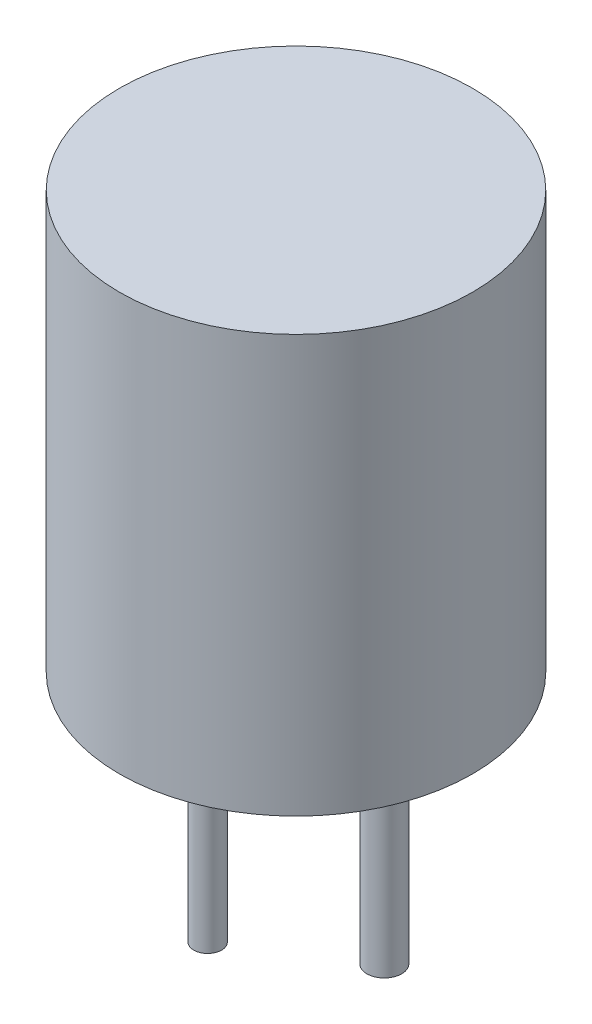
ISO-10303-21;
HEADER;
FILE_DESCRIPTION(('STEP AP214'),'2;1');
FILE_NAME('part.step','',(''),(''),'','','');
FILE_SCHEMA(('AUTOMOTIVE_DESIGN { 1 0 10303 214 1 1 1 1 }'));
ENDSEC;
DATA;
#1=APPLICATION_CONTEXT('core data for automotive mechanical design processes');
#2=APPLICATION_PROTOCOL_DEFINITION('international standard','automotive_design',2000,#1);
#3=PRODUCT_CONTEXT('',#1,'mechanical');
#4=PRODUCT('Part','Part','',(#3));
#5=PRODUCT_RELATED_PRODUCT_CATEGORY('part','',(#4));
#6=PRODUCT_DEFINITION_FORMATION('','',#4);
#7=PRODUCT_DEFINITION_CONTEXT('part definition',#1,'design');
#8=PRODUCT_DEFINITION('design','',#6,#7);
#9=PRODUCT_DEFINITION_SHAPE('','',#8);
#10=(LENGTH_UNIT() NAMED_UNIT(*) SI_UNIT(.MILLI.,.METRE.));
#11=(NAMED_UNIT(*) PLANE_ANGLE_UNIT() SI_UNIT($,.RADIAN.));
#12=(NAMED_UNIT(*) SI_UNIT($,.STERADIAN.) SOLID_ANGLE_UNIT());
#13=UNCERTAINTY_MEASURE_WITH_UNIT(LENGTH_MEASURE(1.E-05),#10,'distance_accuracy_value','');
#14=(GEOMETRIC_REPRESENTATION_CONTEXT(3) GLOBAL_UNCERTAINTY_ASSIGNED_CONTEXT((#13)) GLOBAL_UNIT_ASSIGNED_CONTEXT((#10,
#11,#12)) REPRESENTATION_CONTEXT('',''));
#15=CARTESIAN_POINT('',(0.,0.,0.));
#16=DIRECTION('',(0.,0.,1.));
#17=DIRECTION('',(1.,0.,0.));
#18=AXIS2_PLACEMENT_3D('',#15,#16,#17);
#19=CARTESIAN_POINT('',(0.,0.,0.));
#20=DIRECTION('',(0.,1.,0.));
#21=DIRECTION('',(0.,0.,1.));
#22=AXIS2_PLACEMENT_3D('',#19,#20,#21);
#23=PLANE('',#22);
#24=CARTESIAN_POINT('',(-2.54,0.,0.));
#25=DIRECTION('',(0.,1.,0.));
#26=DIRECTION('',(0.,0.,1.));
#27=AXIS2_PLACEMENT_3D('',#24,#25,#26);
#28=CIRCLE('',#27,0.4);
#29=CARTESIAN_POINT('',(-2.54,0.,0.4));
#30=VERTEX_POINT('',#29);
#31=EDGE_CURVE('E37',#30,#30,#28,.F.);
#32=ORIENTED_EDGE('',*,*,#31,.F.);
#33=EDGE_LOOP('',(#32));
#34=FACE_BOUND('',#33,.T.);
#35=CARTESIAN_POINT('',(0.,0.,0.));
#36=DIRECTION('',(0.,1.,0.));
#37=DIRECTION('',(0.,0.,1.));
#38=AXIS2_PLACEMENT_3D('',#35,#36,#37);
#39=CIRCLE('',#38,5.08);
#40=CARTESIAN_POINT('',(0.,0.,5.08));
#41=VERTEX_POINT('',#40);
#42=EDGE_CURVE('E45',#41,#41,#39,.T.);
#43=ORIENTED_EDGE('',*,*,#42,.F.);
#44=EDGE_LOOP('',(#43));
#45=FACE_BOUND('',#44,.T.);
#46=CARTESIAN_POINT('',(2.54,0.,0.));
#47=DIRECTION('',(0.,1.,0.));
#48=DIRECTION('',(0.,0.,1.));
#49=AXIS2_PLACEMENT_3D('',#46,#47,#48);
#50=CIRCLE('',#49,0.500000000000001);
#51=CARTESIAN_POINT('',(2.54,0.,0.5));
#52=VERTEX_POINT('',#51);
#53=EDGE_CURVE('E10',#52,#52,#50,.F.);
#54=ORIENTED_EDGE('',*,*,#53,.F.);
#55=EDGE_LOOP('',(#54));
#56=FACE_BOUND('',#55,.T.);
#57=ADVANCED_FACE('F30',(#34,#45,#56),#23,.F.);
#58=CARTESIAN_POINT('',(0.,12.,0.));
#59=DIRECTION('',(0.,-1.,0.));
#60=DIRECTION('',(0.,0.,-1.));
#61=AXIS2_PLACEMENT_3D('',#58,#59,#60);
#62=CYLINDRICAL_SURFACE('',#61,5.08);
#63=CARTESIAN_POINT('',(0.,12.,0.));
#64=DIRECTION('',(0.,1.,0.));
#65=DIRECTION('',(0.,0.,1.));
#66=AXIS2_PLACEMENT_3D('',#63,#64,#65);
#67=CIRCLE('',#66,5.08);
#68=CARTESIAN_POINT('',(0.,12.,5.08));
#69=VERTEX_POINT('',#68);
#70=EDGE_CURVE('E41',#69,#69,#67,.T.);
#71=ORIENTED_EDGE('',*,*,#70,.F.);
#72=EDGE_LOOP('',(#71));
#73=FACE_BOUND('',#72,.T.);
#74=ORIENTED_EDGE('',*,*,#42,.T.);
#75=EDGE_LOOP('',(#74));
#76=FACE_BOUND('',#75,.T.);
#77=ADVANCED_FACE('F32',(#73,#76),#62,.T.);
#78=CARTESIAN_POINT('',(0.,12.,0.));
#79=DIRECTION('',(0.,1.,0.));
#80=DIRECTION('',(0.,0.,1.));
#81=AXIS2_PLACEMENT_3D('',#78,#79,#80);
#82=PLANE('',#81);
#83=ORIENTED_EDGE('',*,*,#70,.T.);
#84=EDGE_LOOP('',(#83));
#85=FACE_BOUND('',#84,.T.);
#86=ADVANCED_FACE('F77',(#85),#82,.T.);
#87=CARTESIAN_POINT('',(-2.54,-8.,0.));
#88=DIRECTION('',(0.,1.,0.));
#89=DIRECTION('',(0.,0.,1.));
#90=AXIS2_PLACEMENT_3D('',#87,#88,#89);
#91=CYLINDRICAL_SURFACE('',#90,0.4);
#92=CARTESIAN_POINT('',(-2.54,-8.,0.));
#93=DIRECTION('',(0.,-1.,0.));
#94=DIRECTION('',(0.,0.,-1.));
#95=AXIS2_PLACEMENT_3D('',#92,#93,#94);
#96=CIRCLE('',#95,0.4);
#97=CARTESIAN_POINT('',(-2.54,-8.,-0.4));
#98=VERTEX_POINT('',#97);
#99=EDGE_CURVE('E50',#98,#98,#96,.T.);
#100=ORIENTED_EDGE('',*,*,#99,.F.);
#101=EDGE_LOOP('',(#100));
#102=FACE_BOUND('',#101,.T.);
#103=ORIENTED_EDGE('',*,*,#31,.T.);
#104=EDGE_LOOP('',(#103));
#105=FACE_BOUND('',#104,.T.);
#106=ADVANCED_FACE('F68',(#102,#105),#91,.T.);
#107=CARTESIAN_POINT('',(-2.54,-8.,0.));
#108=DIRECTION('',(0.,-1.,0.));
#109=DIRECTION('',(0.,0.,-1.));
#110=AXIS2_PLACEMENT_3D('',#107,#108,#109);
#111=PLANE('',#110);
#112=ORIENTED_EDGE('',*,*,#99,.T.);
#113=EDGE_LOOP('',(#112));
#114=FACE_BOUND('',#113,.T.);
#115=ADVANCED_FACE('F61',(#114),#111,.T.);
#116=CARTESIAN_POINT('',(2.54,-6.,0.));
#117=DIRECTION('',(0.,1.,0.));
#118=DIRECTION('',(0.,0.,1.));
#119=AXIS2_PLACEMENT_3D('',#116,#117,#118);
#120=CYLINDRICAL_SURFACE('',#119,0.500000000000001);
#121=CARTESIAN_POINT('',(2.54,-6.,0.));
#122=DIRECTION('',(0.,-1.,0.));
#123=DIRECTION('',(0.,0.,-1.));
#124=AXIS2_PLACEMENT_3D('',#121,#122,#123);
#125=CIRCLE('',#124,0.500000000000001);
#126=CARTESIAN_POINT('',(2.54,-6.,-0.500000000000001));
#127=VERTEX_POINT('',#126);
#128=EDGE_CURVE('E53',#127,#127,#125,.T.);
#129=ORIENTED_EDGE('',*,*,#128,.F.);
#130=EDGE_LOOP('',(#129));
#131=FACE_BOUND('',#130,.T.);
#132=ORIENTED_EDGE('',*,*,#53,.T.);
#133=EDGE_LOOP('',(#132));
#134=FACE_BOUND('',#133,.T.);
#135=ADVANCED_FACE('F59',(#131,#134),#120,.T.);
#136=CARTESIAN_POINT('',(2.54,-6.,0.));
#137=DIRECTION('',(0.,-1.,0.));
#138=DIRECTION('',(0.,0.,-1.));
#139=AXIS2_PLACEMENT_3D('',#136,#137,#138);
#140=PLANE('',#139);
#141=ORIENTED_EDGE('',*,*,#128,.T.);
#142=EDGE_LOOP('',(#141));
#143=FACE_BOUND('',#142,.T.);
#144=ADVANCED_FACE('F57',(#143),#140,.T.);
#145=CLOSED_SHELL('',(#57,#77,#86,#106,#115,#135,#144));
#146=MANIFOLD_SOLID_BREP('B2',#145);
#147=ADVANCED_BREP_SHAPE_REPRESENTATION('',(#18,#146),#14);
#148=SHAPE_DEFINITION_REPRESENTATION(#9,#147);
ENDSEC;
END-ISO-10303-21;
